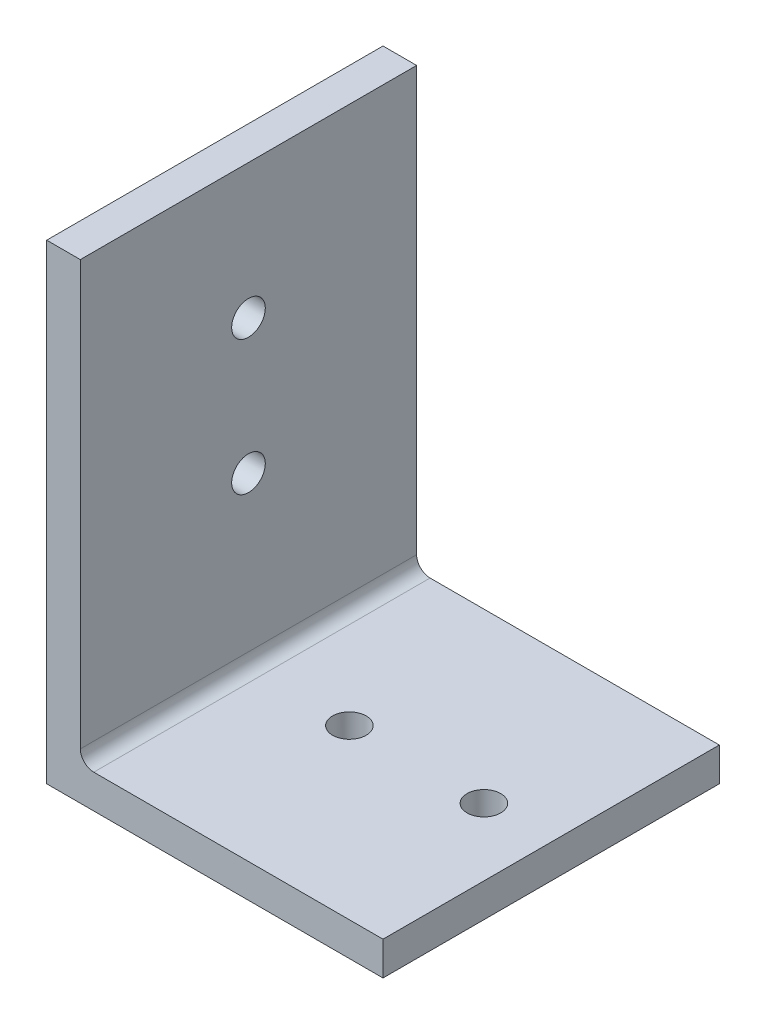
ISO-10303-21;
HEADER;
FILE_DESCRIPTION(('STEP AP214'),'2;1');
FILE_NAME('part.step','',(''),(''),'','','');
FILE_SCHEMA(('AUTOMOTIVE_DESIGN { 1 0 10303 214 1 1 1 1 }'));
ENDSEC;
DATA;
#1=APPLICATION_CONTEXT('core data for automotive mechanical design processes');
#2=APPLICATION_PROTOCOL_DEFINITION('international standard','automotive_design',2000,#1);
#3=PRODUCT_CONTEXT('',#1,'mechanical');
#4=PRODUCT('Part','Part','',(#3));
#5=PRODUCT_RELATED_PRODUCT_CATEGORY('part','',(#4));
#6=PRODUCT_DEFINITION_FORMATION('','',#4);
#7=PRODUCT_DEFINITION_CONTEXT('part definition',#1,'design');
#8=PRODUCT_DEFINITION('design','',#6,#7);
#9=PRODUCT_DEFINITION_SHAPE('','',#8);
#10=(LENGTH_UNIT() NAMED_UNIT(*) SI_UNIT(.MILLI.,.METRE.));
#11=(NAMED_UNIT(*) PLANE_ANGLE_UNIT() SI_UNIT($,.RADIAN.));
#12=(NAMED_UNIT(*) SI_UNIT($,.STERADIAN.) SOLID_ANGLE_UNIT());
#13=UNCERTAINTY_MEASURE_WITH_UNIT(LENGTH_MEASURE(1.E-05),#10,'distance_accuracy_value','');
#14=(GEOMETRIC_REPRESENTATION_CONTEXT(3) GLOBAL_UNCERTAINTY_ASSIGNED_CONTEXT((#13)) GLOBAL_UNIT_ASSIGNED_CONTEXT((#10,
#11,#12)) REPRESENTATION_CONTEXT('',''));
#15=CARTESIAN_POINT('',(0.,0.,0.));
#16=DIRECTION('',(0.,0.,1.));
#17=DIRECTION('',(1.,0.,0.));
#18=AXIS2_PLACEMENT_3D('',#15,#16,#17);
#19=CARTESIAN_POINT('',(63.5,0.,31.75));
#20=DIRECTION('',(0.,1.,0.));
#21=DIRECTION('',(-1.,0.,0.));
#22=AXIS2_PLACEMENT_3D('',#19,#20,#21);
#23=PLANE('',#22);
#24=CARTESIAN_POINT('',(25.4,0.,0.));
#25=DIRECTION('',(0.,-1.,0.));
#26=DIRECTION('',(1.,0.,0.));
#27=AXIS2_PLACEMENT_3D('',#24,#25,#26);
#28=CIRCLE('',#27,3.175);
#29=CARTESIAN_POINT('',(28.575,0.,0.));
#30=VERTEX_POINT('',#29);
#31=EDGE_CURVE('E175',#30,#30,#28,.T.);
#32=ORIENTED_EDGE('',*,*,#31,.F.);
#33=EDGE_LOOP('',(#32));
#34=FACE_BOUND('',#33,.T.);
#35=CARTESIAN_POINT('',(50.8,0.,0.));
#36=DIRECTION('',(0.,-1.,0.));
#37=DIRECTION('',(1.,0.,0.));
#38=AXIS2_PLACEMENT_3D('',#35,#36,#37);
#39=CIRCLE('',#38,3.175);
#40=CARTESIAN_POINT('',(53.975,0.,0.));
#41=VERTEX_POINT('',#40);
#42=EDGE_CURVE('E166',#41,#41,#39,.T.);
#43=ORIENTED_EDGE('',*,*,#42,.F.);
#44=EDGE_LOOP('',(#43));
#45=FACE_BOUND('',#44,.T.);
#46=DIRECTION('',(1.,0.,0.));
#47=VECTOR('',#46,1.);
#48=CARTESIAN_POINT('',(63.5,0.,-31.75));
#49=LINE('',#48,#47);
#50=CARTESIAN_POINT('',(0.,0.,-31.75));
#51=VERTEX_POINT('',#50);
#52=CARTESIAN_POINT('',(63.5,0.,-31.75));
#53=VERTEX_POINT('',#52);
#54=EDGE_CURVE('E123',#51,#53,#49,.T.);
#55=ORIENTED_EDGE('',*,*,#54,.T.);
#56=DIRECTION('',(0.,0.,-1.));
#57=VECTOR('',#56,1.);
#58=CARTESIAN_POINT('',(63.5,0.,31.75));
#59=LINE('',#58,#57);
#60=CARTESIAN_POINT('',(63.5,0.,31.75));
#61=VERTEX_POINT('',#60);
#62=EDGE_CURVE('E106',#61,#53,#59,.T.);
#63=ORIENTED_EDGE('',*,*,#62,.F.);
#64=DIRECTION('',(1.,0.,0.));
#65=VECTOR('',#64,1.);
#66=CARTESIAN_POINT('',(63.5,0.,31.75));
#67=LINE('',#66,#65);
#68=CARTESIAN_POINT('',(0.,0.,31.75));
#69=VERTEX_POINT('',#68);
#70=EDGE_CURVE('E115',#69,#61,#67,.T.);
#71=ORIENTED_EDGE('',*,*,#70,.F.);
#72=DIRECTION('',(0.,0.,-1.));
#73=VECTOR('',#72,1.);
#74=CARTESIAN_POINT('',(0.,0.,31.75));
#75=LINE('',#74,#73);
#76=EDGE_CURVE('E137',#69,#51,#75,.T.);
#77=ORIENTED_EDGE('',*,*,#76,.T.);
#78=EDGE_LOOP('',(#55,#63,#71,#77));
#79=FACE_BOUND('',#78,.T.);
#80=ADVANCED_FACE('F43',(#34,#45,#79),#23,.F.);
#81=CARTESIAN_POINT('',(63.5,6.35,31.75));
#82=DIRECTION('',(-1.,0.,0.));
#83=DIRECTION('',(0.,0.,1.));
#84=AXIS2_PLACEMENT_3D('',#81,#82,#83);
#85=PLANE('',#84);
#86=DIRECTION('',(0.,1.,0.));
#87=VECTOR('',#86,1.);
#88=CARTESIAN_POINT('',(63.5,6.35,-31.75));
#89=LINE('',#88,#87);
#90=CARTESIAN_POINT('',(63.5,6.35,-31.75));
#91=VERTEX_POINT('',#90);
#92=EDGE_CURVE('E150',#53,#91,#89,.T.);
#93=ORIENTED_EDGE('',*,*,#92,.T.);
#94=DIRECTION('',(0.,0.,-1.));
#95=VECTOR('',#94,1.);
#96=CARTESIAN_POINT('',(63.5,6.35,31.75));
#97=LINE('',#96,#95);
#98=CARTESIAN_POINT('',(63.5,6.35,31.75));
#99=VERTEX_POINT('',#98);
#100=EDGE_CURVE('E108',#99,#91,#97,.T.);
#101=ORIENTED_EDGE('',*,*,#100,.F.);
#102=DIRECTION('',(0.,1.,0.));
#103=VECTOR('',#102,1.);
#104=CARTESIAN_POINT('',(63.5,6.35,31.75));
#105=LINE('',#104,#103);
#106=EDGE_CURVE('E105',#61,#99,#105,.T.);
#107=ORIENTED_EDGE('',*,*,#106,.F.);
#108=ORIENTED_EDGE('',*,*,#62,.T.);
#109=EDGE_LOOP('',(#93,#101,#107,#108));
#110=FACE_BOUND('',#109,.T.);
#111=ADVANCED_FACE('F102',(#110),#85,.F.);
#112=CARTESIAN_POINT('',(6.35,6.35,31.75));
#113=DIRECTION('',(0.,-1.,0.));
#114=DIRECTION('',(0.,0.,-1.));
#115=AXIS2_PLACEMENT_3D('',#112,#113,#114);
#116=PLANE('',#115);
#117=CARTESIAN_POINT('',(25.4,6.34999999999999,0.));
#118=DIRECTION('',(0.,-1.,0.));
#119=DIRECTION('',(0.,0.,-1.));
#120=AXIS2_PLACEMENT_3D('',#117,#118,#119);
#121=CIRCLE('',#120,3.175);
#122=CARTESIAN_POINT('',(25.4,6.34999999999999,-3.175));
#123=VERTEX_POINT('',#122);
#124=EDGE_CURVE('E163',#123,#123,#121,.F.);
#125=ORIENTED_EDGE('',*,*,#124,.F.);
#126=EDGE_LOOP('',(#125));
#127=FACE_BOUND('',#126,.T.);
#128=CARTESIAN_POINT('',(50.8,6.34999999999999,0.));
#129=DIRECTION('',(0.,-1.,0.));
#130=DIRECTION('',(0.,0.,-1.));
#131=AXIS2_PLACEMENT_3D('',#128,#129,#130);
#132=CIRCLE('',#131,3.175);
#133=CARTESIAN_POINT('',(50.8,6.34999999999999,-3.175));
#134=VERTEX_POINT('',#133);
#135=EDGE_CURVE('E171',#134,#134,#132,.F.);
#136=ORIENTED_EDGE('',*,*,#135,.F.);
#137=EDGE_LOOP('',(#136));
#138=FACE_BOUND('',#137,.T.);
#139=DIRECTION('',(-1.,0.,0.));
#140=VECTOR('',#139,1.);
#141=CARTESIAN_POINT('',(6.35,6.35,-31.75));
#142=LINE('',#141,#140);
#143=CARTESIAN_POINT('',(8.89,6.35,-31.75));
#144=VERTEX_POINT('',#143);
#145=EDGE_CURVE('E144',#91,#144,#142,.T.);
#146=ORIENTED_EDGE('',*,*,#145,.T.);
#147=DIRECTION('',(0.,0.,-1.));
#148=VECTOR('',#147,1.);
#149=CARTESIAN_POINT('',(8.89,6.35,31.75));
#150=LINE('',#149,#148);
#151=CARTESIAN_POINT('',(8.89,6.35,31.75));
#152=VERTEX_POINT('',#151);
#153=EDGE_CURVE('E59',#144,#152,#150,.F.);
#154=ORIENTED_EDGE('',*,*,#153,.T.);
#155=DIRECTION('',(-1.,0.,0.));
#156=VECTOR('',#155,1.);
#157=CARTESIAN_POINT('',(6.35,6.35,31.75));
#158=LINE('',#157,#156);
#159=EDGE_CURVE('E112',#99,#152,#158,.T.);
#160=ORIENTED_EDGE('',*,*,#159,.F.);
#161=ORIENTED_EDGE('',*,*,#100,.T.);
#162=EDGE_LOOP('',(#146,#154,#160,#161));
#163=FACE_BOUND('',#162,.T.);
#164=ADVANCED_FACE('F194',(#127,#138,#163),#116,.F.);
#165=CARTESIAN_POINT('',(6.34999999999999,88.9,31.75));
#166=DIRECTION('',(-1.,0.,0.));
#167=DIRECTION('',(0.,-1.,0.));
#168=AXIS2_PLACEMENT_3D('',#165,#166,#167);
#169=PLANE('',#168);
#170=CARTESIAN_POINT('',(6.34999999999999,63.5,0.));
#171=DIRECTION('',(-1.,0.,0.));
#172=DIRECTION('',(0.,-1.,0.));
#173=AXIS2_PLACEMENT_3D('',#170,#171,#172);
#174=CIRCLE('',#173,3.175);
#175=CARTESIAN_POINT('',(6.34999999999999,60.325,0.));
#176=VERTEX_POINT('',#175);
#177=EDGE_CURVE('E147',#176,#176,#174,.F.);
#178=ORIENTED_EDGE('',*,*,#177,.F.);
#179=EDGE_LOOP('',(#178));
#180=FACE_BOUND('',#179,.T.);
#181=CARTESIAN_POINT('',(6.35,38.1,0.));
#182=DIRECTION('',(-1.,0.,0.));
#183=DIRECTION('',(0.,-1.,0.));
#184=AXIS2_PLACEMENT_3D('',#181,#182,#183);
#185=CIRCLE('',#184,3.175);
#186=CARTESIAN_POINT('',(6.35,34.925,0.));
#187=VERTEX_POINT('',#186);
#188=EDGE_CURVE('E161',#187,#187,#185,.F.);
#189=ORIENTED_EDGE('',*,*,#188,.F.);
#190=EDGE_LOOP('',(#189));
#191=FACE_BOUND('',#190,.T.);
#192=DIRECTION('',(0.,1.,0.));
#193=VECTOR('',#192,1.);
#194=CARTESIAN_POINT('',(6.34999999999999,88.9,31.75));
#195=LINE('',#194,#193);
#196=CARTESIAN_POINT('',(6.35,8.89,31.75));
#197=VERTEX_POINT('',#196);
#198=CARTESIAN_POINT('',(6.34999999999999,88.9,31.75));
#199=VERTEX_POINT('',#198);
#200=EDGE_CURVE('E152',#197,#199,#195,.T.);
#201=ORIENTED_EDGE('',*,*,#200,.F.);
#202=DIRECTION('',(0.,0.,-1.));
#203=VECTOR('',#202,1.);
#204=CARTESIAN_POINT('',(6.35,8.89,-31.75));
#205=LINE('',#204,#203);
#206=CARTESIAN_POINT('',(6.35,8.89,-31.75));
#207=VERTEX_POINT('',#206);
#208=EDGE_CURVE('E124',#197,#207,#205,.T.);
#209=ORIENTED_EDGE('',*,*,#208,.T.);
#210=DIRECTION('',(0.,1.,0.));
#211=VECTOR('',#210,1.);
#212=CARTESIAN_POINT('',(6.34999999999999,88.9,-31.75));
#213=LINE('',#212,#211);
#214=CARTESIAN_POINT('',(6.34999999999999,88.9,-31.75));
#215=VERTEX_POINT('',#214);
#216=EDGE_CURVE('E141',#207,#215,#213,.T.);
#217=ORIENTED_EDGE('',*,*,#216,.T.);
#218=DIRECTION('',(0.,0.,-1.));
#219=VECTOR('',#218,1.);
#220=CARTESIAN_POINT('',(6.34999999999999,88.9,31.75));
#221=LINE('',#220,#219);
#222=EDGE_CURVE('E129',#199,#215,#221,.T.);
#223=ORIENTED_EDGE('',*,*,#222,.F.);
#224=EDGE_LOOP('',(#201,#209,#217,#223));
#225=FACE_BOUND('',#224,.T.);
#226=ADVANCED_FACE('F197',(#180,#191,#225),#169,.F.);
#227=CARTESIAN_POINT('',(0.,88.9,31.75));
#228=DIRECTION('',(0.,-1.,0.));
#229=DIRECTION('',(0.,0.,-1.));
#230=AXIS2_PLACEMENT_3D('',#227,#228,#229);
#231=PLANE('',#230);
#232=DIRECTION('',(-1.,0.,0.));
#233=VECTOR('',#232,1.);
#234=CARTESIAN_POINT('',(0.,88.9,-31.75));
#235=LINE('',#234,#233);
#236=CARTESIAN_POINT('',(0.,88.9,-31.75));
#237=VERTEX_POINT('',#236);
#238=EDGE_CURVE('E143',#215,#237,#235,.T.);
#239=ORIENTED_EDGE('',*,*,#238,.T.);
#240=DIRECTION('',(0.,0.,-1.));
#241=VECTOR('',#240,1.);
#242=CARTESIAN_POINT('',(0.,88.9,31.75));
#243=LINE('',#242,#241);
#244=CARTESIAN_POINT('',(0.,88.9,31.75));
#245=VERTEX_POINT('',#244);
#246=EDGE_CURVE('E132',#245,#237,#243,.T.);
#247=ORIENTED_EDGE('',*,*,#246,.F.);
#248=DIRECTION('',(-1.,0.,0.));
#249=VECTOR('',#248,1.);
#250=CARTESIAN_POINT('',(0.,88.9,31.75));
#251=LINE('',#250,#249);
#252=EDGE_CURVE('E155',#199,#245,#251,.T.);
#253=ORIENTED_EDGE('',*,*,#252,.F.);
#254=ORIENTED_EDGE('',*,*,#222,.T.);
#255=EDGE_LOOP('',(#239,#247,#253,#254));
#256=FACE_BOUND('',#255,.T.);
#257=ADVANCED_FACE('F209',(#256),#231,.F.);
#258=CARTESIAN_POINT('',(0.,0.,31.75));
#259=DIRECTION('',(1.,0.,0.));
#260=DIRECTION('',(0.,0.,-1.));
#261=AXIS2_PLACEMENT_3D('',#258,#259,#260);
#262=PLANE('',#261);
#263=CARTESIAN_POINT('',(0.,63.5,0.));
#264=DIRECTION('',(-1.,0.,0.));
#265=DIRECTION('',(0.,0.,1.));
#266=AXIS2_PLACEMENT_3D('',#263,#264,#265);
#267=CIRCLE('',#266,3.175);
#268=CARTESIAN_POINT('',(0.,63.5,3.175));
#269=VERTEX_POINT('',#268);
#270=EDGE_CURVE('E159',#269,#269,#267,.T.);
#271=ORIENTED_EDGE('',*,*,#270,.F.);
#272=EDGE_LOOP('',(#271));
#273=FACE_BOUND('',#272,.T.);
#274=CARTESIAN_POINT('',(0.,38.1,0.));
#275=DIRECTION('',(-1.,0.,0.));
#276=DIRECTION('',(0.,0.,1.));
#277=AXIS2_PLACEMENT_3D('',#274,#275,#276);
#278=CIRCLE('',#277,3.175);
#279=CARTESIAN_POINT('',(0.,38.1,3.175));
#280=VERTEX_POINT('',#279);
#281=EDGE_CURVE('E160',#280,#280,#278,.T.);
#282=ORIENTED_EDGE('',*,*,#281,.F.);
#283=EDGE_LOOP('',(#282));
#284=FACE_BOUND('',#283,.T.);
#285=DIRECTION('',(0.,-1.,0.));
#286=VECTOR('',#285,1.);
#287=CARTESIAN_POINT('',(0.,0.,-31.75));
#288=LINE('',#287,#286);
#289=EDGE_CURVE('E121',#237,#51,#288,.T.);
#290=ORIENTED_EDGE('',*,*,#289,.T.);
#291=ORIENTED_EDGE('',*,*,#76,.F.);
#292=DIRECTION('',(0.,-1.,0.));
#293=VECTOR('',#292,1.);
#294=CARTESIAN_POINT('',(0.,0.,31.75));
#295=LINE('',#294,#293);
#296=EDGE_CURVE('E120',#245,#69,#295,.T.);
#297=ORIENTED_EDGE('',*,*,#296,.F.);
#298=ORIENTED_EDGE('',*,*,#246,.T.);
#299=EDGE_LOOP('',(#290,#291,#297,#298));
#300=FACE_BOUND('',#299,.T.);
#301=ADVANCED_FACE('F213',(#273,#284,#300),#262,.F.);
#302=CARTESIAN_POINT('',(0.,0.,31.75));
#303=DIRECTION('',(0.,0.,-1.));
#304=DIRECTION('',(-1.,0.,0.));
#305=AXIS2_PLACEMENT_3D('',#302,#303,#304);
#306=PLANE('',#305);
#307=ORIENTED_EDGE('',*,*,#70,.T.);
#308=ORIENTED_EDGE('',*,*,#106,.T.);
#309=ORIENTED_EDGE('',*,*,#159,.T.);
#310=CARTESIAN_POINT('',(8.89,8.89,31.75));
#311=DIRECTION('',(0.,0.,-1.));
#312=DIRECTION('',(-1.,0.,0.));
#313=AXIS2_PLACEMENT_3D('',#310,#311,#312);
#314=CIRCLE('',#313,2.54);
#315=EDGE_CURVE('E11',#152,#197,#314,.T.);
#316=ORIENTED_EDGE('',*,*,#315,.T.);
#317=ORIENTED_EDGE('',*,*,#200,.T.);
#318=ORIENTED_EDGE('',*,*,#252,.T.);
#319=ORIENTED_EDGE('',*,*,#296,.T.);
#320=EDGE_LOOP('',(#307,#308,#309,#316,#317,#318,#319));
#321=FACE_BOUND('',#320,.T.);
#322=ADVANCED_FACE('F113',(#321),#306,.F.);
#323=CARTESIAN_POINT('',(0.,0.,-31.75));
#324=DIRECTION('',(0.,0.,-1.));
#325=DIRECTION('',(-1.,0.,0.));
#326=AXIS2_PLACEMENT_3D('',#323,#324,#325);
#327=PLANE('',#326);
#328=ORIENTED_EDGE('',*,*,#54,.F.);
#329=ORIENTED_EDGE('',*,*,#289,.F.);
#330=ORIENTED_EDGE('',*,*,#238,.F.);
#331=ORIENTED_EDGE('',*,*,#216,.F.);
#332=CARTESIAN_POINT('',(8.89,8.89,-31.75));
#333=DIRECTION('',(0.,0.,-1.));
#334=DIRECTION('',(-1.,0.,0.));
#335=AXIS2_PLACEMENT_3D('',#332,#333,#334);
#336=CIRCLE('',#335,2.54);
#337=EDGE_CURVE('E51',#207,#144,#336,.F.);
#338=ORIENTED_EDGE('',*,*,#337,.T.);
#339=ORIENTED_EDGE('',*,*,#145,.F.);
#340=ORIENTED_EDGE('',*,*,#92,.F.);
#341=EDGE_LOOP('',(#328,#329,#330,#331,#338,#339,#340));
#342=FACE_BOUND('',#341,.T.);
#343=ADVANCED_FACE('F212',(#342),#327,.T.);
#344=CARTESIAN_POINT('',(63.501,38.1,0.));
#345=DIRECTION('',(-1.,0.,0.));
#346=DIRECTION('',(0.,0.,1.));
#347=AXIS2_PLACEMENT_3D('',#344,#345,#346);
#348=CYLINDRICAL_SURFACE('',#347,3.175);
#349=ORIENTED_EDGE('',*,*,#281,.T.);
#350=EDGE_LOOP('',(#349));
#351=FACE_BOUND('',#350,.T.);
#352=ORIENTED_EDGE('',*,*,#188,.T.);
#353=EDGE_LOOP('',(#352));
#354=FACE_BOUND('',#353,.T.);
#355=ADVANCED_FACE('F216',(#351,#354),#348,.F.);
#356=CARTESIAN_POINT('',(63.501,63.5,0.));
#357=DIRECTION('',(-1.,0.,0.));
#358=DIRECTION('',(0.,0.,1.));
#359=AXIS2_PLACEMENT_3D('',#356,#357,#358);
#360=CYLINDRICAL_SURFACE('',#359,3.175);
#361=ORIENTED_EDGE('',*,*,#270,.T.);
#362=EDGE_LOOP('',(#361));
#363=FACE_BOUND('',#362,.T.);
#364=ORIENTED_EDGE('',*,*,#177,.T.);
#365=EDGE_LOOP('',(#364));
#366=FACE_BOUND('',#365,.T.);
#367=ADVANCED_FACE('F191',(#363,#366),#360,.F.);
#368=CARTESIAN_POINT('',(50.8,88.901,0.));
#369=DIRECTION('',(0.,-1.,0.));
#370=DIRECTION('',(1.,0.,0.));
#371=AXIS2_PLACEMENT_3D('',#368,#369,#370);
#372=CYLINDRICAL_SURFACE('',#371,3.175);
#373=ORIENTED_EDGE('',*,*,#42,.T.);
#374=EDGE_LOOP('',(#373));
#375=FACE_BOUND('',#374,.T.);
#376=ORIENTED_EDGE('',*,*,#135,.T.);
#377=EDGE_LOOP('',(#376));
#378=FACE_BOUND('',#377,.T.);
#379=ADVANCED_FACE('F186',(#375,#378),#372,.F.);
#380=CARTESIAN_POINT('',(25.4,88.901,0.));
#381=DIRECTION('',(0.,-1.,0.));
#382=DIRECTION('',(1.,0.,0.));
#383=AXIS2_PLACEMENT_3D('',#380,#381,#382);
#384=CYLINDRICAL_SURFACE('',#383,3.175);
#385=ORIENTED_EDGE('',*,*,#31,.T.);
#386=EDGE_LOOP('',(#385));
#387=FACE_BOUND('',#386,.T.);
#388=ORIENTED_EDGE('',*,*,#124,.T.);
#389=EDGE_LOOP('',(#388));
#390=FACE_BOUND('',#389,.T.);
#391=ADVANCED_FACE('F182',(#387,#390),#384,.F.);
#392=CARTESIAN_POINT('',(8.89,8.89,31.75));
#393=DIRECTION('',(0.,0.,1.));
#394=DIRECTION('',(1.,0.,0.));
#395=AXIS2_PLACEMENT_3D('',#392,#393,#394);
#396=CYLINDRICAL_SURFACE('',#395,2.54);
#397=ORIENTED_EDGE('',*,*,#315,.F.);
#398=ORIENTED_EDGE('',*,*,#153,.F.);
#399=ORIENTED_EDGE('',*,*,#337,.F.);
#400=ORIENTED_EDGE('',*,*,#208,.F.);
#401=EDGE_LOOP('',(#397,#398,#399,#400));
#402=FACE_BOUND('',#401,.T.);
#403=ADVANCED_FACE('F44',(#402),#396,.F.);
#404=CLOSED_SHELL('',(#80,#111,#164,#226,#257,#301,#322,#343,#355,#367,#379,#391,#403));
#405=MANIFOLD_SOLID_BREP('B2',#404);
#406=ADVANCED_BREP_SHAPE_REPRESENTATION('',(#18,#405),#14);
#407=SHAPE_DEFINITION_REPRESENTATION(#9,#406);
ENDSEC;
END-ISO-10303-21;
